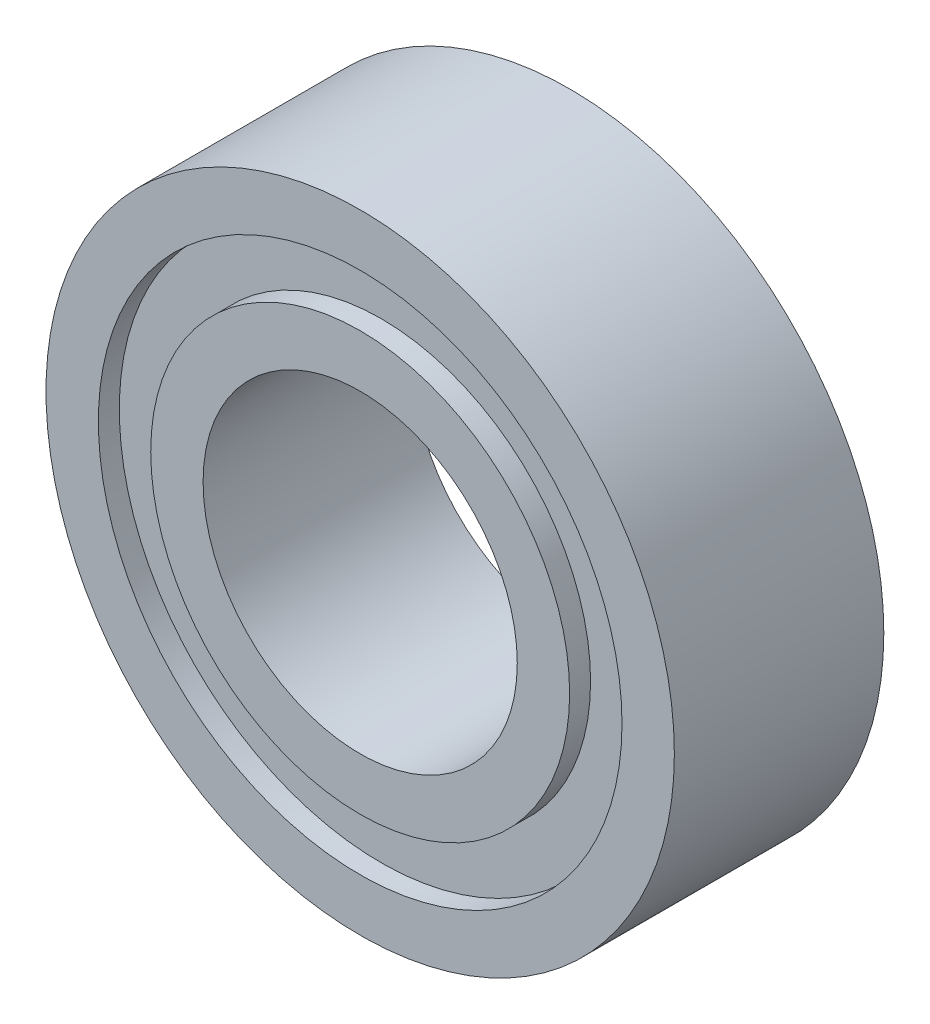
ISO-10303-21;
HEADER;
FILE_DESCRIPTION(('STEP AP214'),'2;1');
FILE_NAME('part.step','',(''),(''),'','','');
FILE_SCHEMA(('AUTOMOTIVE_DESIGN { 1 0 10303 214 1 1 1 1 }'));
ENDSEC;
DATA;
#1=APPLICATION_CONTEXT('core data for automotive mechanical design processes');
#2=APPLICATION_PROTOCOL_DEFINITION('international standard','automotive_design',2000,#1);
#3=PRODUCT_CONTEXT('',#1,'mechanical');
#4=PRODUCT('Part','Part','',(#3));
#5=PRODUCT_RELATED_PRODUCT_CATEGORY('part','',(#4));
#6=PRODUCT_DEFINITION_FORMATION('','',#4);
#7=PRODUCT_DEFINITION_CONTEXT('part definition',#1,'design');
#8=PRODUCT_DEFINITION('design','',#6,#7);
#9=PRODUCT_DEFINITION_SHAPE('','',#8);
#10=(LENGTH_UNIT() NAMED_UNIT(*) SI_UNIT(.MILLI.,.METRE.));
#11=(NAMED_UNIT(*) PLANE_ANGLE_UNIT() SI_UNIT($,.RADIAN.));
#12=(NAMED_UNIT(*) SI_UNIT($,.STERADIAN.) SOLID_ANGLE_UNIT());
#13=UNCERTAINTY_MEASURE_WITH_UNIT(LENGTH_MEASURE(1.E-05),#10,'distance_accuracy_value','');
#14=(GEOMETRIC_REPRESENTATION_CONTEXT(3) GLOBAL_UNCERTAINTY_ASSIGNED_CONTEXT((#13)) GLOBAL_UNIT_ASSIGNED_CONTEXT((#10,
#11,#12)) REPRESENTATION_CONTEXT('',''));
#15=CARTESIAN_POINT('',(0.,0.,0.));
#16=DIRECTION('',(0.,0.,1.));
#17=DIRECTION('',(1.,0.,0.));
#18=AXIS2_PLACEMENT_3D('',#15,#16,#17);
#19=CARTESIAN_POINT('',(0.,0.,0.));
#20=DIRECTION('',(0.,0.,1.));
#21=DIRECTION('',(1.,0.,0.));
#22=AXIS2_PLACEMENT_3D('',#19,#20,#21);
#23=PLANE('',#22);
#24=CARTESIAN_POINT('',(0.,0.,0.));
#25=DIRECTION('',(0.,0.,1.));
#26=DIRECTION('',(1.,0.,0.));
#27=AXIS2_PLACEMENT_3D('',#24,#25,#26);
#28=CIRCLE('',#27,2.38125);
#29=CARTESIAN_POINT('',(2.38125,0.,0.));
#30=VERTEX_POINT('',#29);
#31=EDGE_CURVE('E64',#30,#30,#28,.T.);
#32=ORIENTED_EDGE('',*,*,#31,.T.);
#33=EDGE_LOOP('',(#32));
#34=FACE_BOUND('',#33,.T.);
#35=CARTESIAN_POINT('',(0.,0.,0.));
#36=DIRECTION('',(0.,0.,-1.));
#37=DIRECTION('',(-1.,0.,0.));
#38=AXIS2_PLACEMENT_3D('',#35,#36,#37);
#39=CIRCLE('',#38,3.175);
#40=CARTESIAN_POINT('',(-3.175,0.,0.));
#41=VERTEX_POINT('',#40);
#42=EDGE_CURVE('E94',#41,#41,#39,.T.);
#43=ORIENTED_EDGE('',*,*,#42,.T.);
#44=EDGE_LOOP('',(#43));
#45=FACE_BOUND('',#44,.T.);
#46=ADVANCED_FACE('F47',(#34,#45),#23,.F.);
#47=CARTESIAN_POINT('',(0.,0.,3.175));
#48=DIRECTION('',(0.,0.,1.));
#49=DIRECTION('',(1.,0.,0.));
#50=AXIS2_PLACEMENT_3D('',#47,#48,#49);
#51=PLANE('',#50);
#52=CARTESIAN_POINT('',(0.,0.,3.175));
#53=DIRECTION('',(0.,0.,1.));
#54=DIRECTION('',(1.,0.,0.));
#55=AXIS2_PLACEMENT_3D('',#52,#53,#54);
#56=CIRCLE('',#55,2.38125);
#57=CARTESIAN_POINT('',(2.38125,0.,3.175));
#58=VERTEX_POINT('',#57);
#59=EDGE_CURVE('E62',#58,#58,#56,.T.);
#60=ORIENTED_EDGE('',*,*,#59,.F.);
#61=EDGE_LOOP('',(#60));
#62=FACE_BOUND('',#61,.T.);
#63=CARTESIAN_POINT('',(0.,0.,3.175));
#64=DIRECTION('',(0.,0.,1.));
#65=DIRECTION('',(1.,0.,0.));
#66=AXIS2_PLACEMENT_3D('',#63,#64,#65);
#67=CIRCLE('',#66,3.175);
#68=CARTESIAN_POINT('',(3.175,0.,3.175));
#69=VERTEX_POINT('',#68);
#70=EDGE_CURVE('E79',#69,#69,#67,.T.);
#71=ORIENTED_EDGE('',*,*,#70,.T.);
#72=EDGE_LOOP('',(#71));
#73=FACE_BOUND('',#72,.T.);
#74=ADVANCED_FACE('F134',(#62,#73),#51,.T.);
#75=CARTESIAN_POINT('',(0.,0.,3.175));
#76=DIRECTION('',(0.,0.,1.));
#77=DIRECTION('',(1.,0.,0.));
#78=AXIS2_PLACEMENT_3D('',#75,#76,#77);
#79=CIRCLE('',#78,3.96875);
#80=CARTESIAN_POINT('',(3.96875,0.,3.175));
#81=VERTEX_POINT('',#80);
#82=EDGE_CURVE('E72',#81,#81,#79,.T.);
#83=ORIENTED_EDGE('',*,*,#82,.F.);
#84=EDGE_LOOP('',(#83));
#85=FACE_BOUND('',#84,.T.);
#86=CARTESIAN_POINT('',(0.,0.,3.175));
#87=DIRECTION('',(0.,0.,1.));
#88=DIRECTION('',(1.,0.,0.));
#89=AXIS2_PLACEMENT_3D('',#86,#87,#88);
#90=CIRCLE('',#89,4.7625);
#91=CARTESIAN_POINT('',(4.7625,0.,3.175));
#92=VERTEX_POINT('',#91);
#93=EDGE_CURVE('E10',#92,#92,#90,.T.);
#94=ORIENTED_EDGE('',*,*,#93,.T.);
#95=EDGE_LOOP('',(#94));
#96=FACE_BOUND('',#95,.T.);
#97=ADVANCED_FACE('F121',(#85,#96),#51,.T.);
#98=CARTESIAN_POINT('',(0.,0.,0.));
#99=DIRECTION('',(0.,0.,-1.));
#100=DIRECTION('',(-1.,0.,0.));
#101=AXIS2_PLACEMENT_3D('',#98,#99,#100);
#102=CIRCLE('',#101,3.96875);
#103=CARTESIAN_POINT('',(-3.96875,0.,0.));
#104=VERTEX_POINT('',#103);
#105=EDGE_CURVE('E86',#104,#104,#102,.T.);
#106=ORIENTED_EDGE('',*,*,#105,.F.);
#107=EDGE_LOOP('',(#106));
#108=FACE_BOUND('',#107,.T.);
#109=CARTESIAN_POINT('',(0.,0.,0.));
#110=DIRECTION('',(0.,0.,1.));
#111=DIRECTION('',(1.,0.,0.));
#112=AXIS2_PLACEMENT_3D('',#109,#110,#111);
#113=CIRCLE('',#112,4.7625);
#114=CARTESIAN_POINT('',(4.7625,0.,0.));
#115=VERTEX_POINT('',#114);
#116=EDGE_CURVE('E51',#115,#115,#113,.T.);
#117=ORIENTED_EDGE('',*,*,#116,.F.);
#118=EDGE_LOOP('',(#117));
#119=FACE_BOUND('',#118,.T.);
#120=ADVANCED_FACE('F118',(#108,#119),#23,.F.);
#121=CARTESIAN_POINT('',(0.,0.,3.175));
#122=DIRECTION('',(0.,0.,-1.));
#123=DIRECTION('',(-1.,0.,0.));
#124=AXIS2_PLACEMENT_3D('',#121,#122,#123);
#125=CYLINDRICAL_SURFACE('',#124,4.7625);
#126=ORIENTED_EDGE('',*,*,#93,.F.);
#127=EDGE_LOOP('',(#126));
#128=FACE_BOUND('',#127,.T.);
#129=ORIENTED_EDGE('',*,*,#116,.T.);
#130=EDGE_LOOP('',(#129));
#131=FACE_BOUND('',#130,.T.);
#132=ADVANCED_FACE('F49',(#128,#131),#125,.T.);
#133=CARTESIAN_POINT('',(0.,0.,3.175));
#134=DIRECTION('',(0.,0.,-1.));
#135=DIRECTION('',(-1.,0.,0.));
#136=AXIS2_PLACEMENT_3D('',#133,#134,#135);
#137=CYLINDRICAL_SURFACE('',#136,2.38125);
#138=ORIENTED_EDGE('',*,*,#59,.T.);
#139=EDGE_LOOP('',(#138));
#140=FACE_BOUND('',#139,.T.);
#141=ORIENTED_EDGE('',*,*,#31,.F.);
#142=EDGE_LOOP('',(#141));
#143=FACE_BOUND('',#142,.T.);
#144=ADVANCED_FACE('F125',(#140,#143),#137,.F.);
#145=CARTESIAN_POINT('',(0.,0.,2.8575));
#146=DIRECTION('',(0.,0.,1.));
#147=DIRECTION('',(1.,0.,0.));
#148=AXIS2_PLACEMENT_3D('',#145,#146,#147);
#149=CYLINDRICAL_SURFACE('',#148,3.96875);
#150=CARTESIAN_POINT('',(0.,0.,2.8575));
#151=DIRECTION('',(0.,0.,1.));
#152=DIRECTION('',(1.,0.,0.));
#153=AXIS2_PLACEMENT_3D('',#150,#151,#152);
#154=CIRCLE('',#153,3.96875);
#155=CARTESIAN_POINT('',(3.96875,0.,2.8575));
#156=VERTEX_POINT('',#155);
#157=EDGE_CURVE('E68',#156,#156,#154,.T.);
#158=ORIENTED_EDGE('',*,*,#157,.F.);
#159=EDGE_LOOP('',(#158));
#160=FACE_BOUND('',#159,.T.);
#161=ORIENTED_EDGE('',*,*,#82,.T.);
#162=EDGE_LOOP('',(#161));
#163=FACE_BOUND('',#162,.T.);
#164=ADVANCED_FACE('F130',(#160,#163),#149,.F.);
#165=CARTESIAN_POINT('',(0.,0.,2.8575));
#166=DIRECTION('',(0.,0.,1.));
#167=DIRECTION('',(1.,0.,0.));
#168=AXIS2_PLACEMENT_3D('',#165,#166,#167);
#169=PLANE('',#168);
#170=CARTESIAN_POINT('',(0.,0.,2.8575));
#171=DIRECTION('',(0.,0.,1.));
#172=DIRECTION('',(1.,0.,0.));
#173=AXIS2_PLACEMENT_3D('',#170,#171,#172);
#174=CIRCLE('',#173,3.175);
#175=CARTESIAN_POINT('',(3.175,0.,2.8575));
#176=VERTEX_POINT('',#175);
#177=EDGE_CURVE('E76',#176,#176,#174,.T.);
#178=ORIENTED_EDGE('',*,*,#177,.F.);
#179=EDGE_LOOP('',(#178));
#180=FACE_BOUND('',#179,.T.);
#181=ORIENTED_EDGE('',*,*,#157,.T.);
#182=EDGE_LOOP('',(#181));
#183=FACE_BOUND('',#182,.T.);
#184=ADVANCED_FACE('F146',(#180,#183),#169,.T.);
#185=CARTESIAN_POINT('',(0.,0.,2.8575));
#186=DIRECTION('',(0.,0.,1.));
#187=DIRECTION('',(1.,0.,0.));
#188=AXIS2_PLACEMENT_3D('',#185,#186,#187);
#189=CYLINDRICAL_SURFACE('',#188,3.175);
#190=ORIENTED_EDGE('',*,*,#177,.T.);
#191=EDGE_LOOP('',(#190));
#192=FACE_BOUND('',#191,.T.);
#193=ORIENTED_EDGE('',*,*,#70,.F.);
#194=EDGE_LOOP('',(#193));
#195=FACE_BOUND('',#194,.T.);
#196=ADVANCED_FACE('F114',(#192,#195),#189,.T.);
#197=CARTESIAN_POINT('',(0.,0.,0.635));
#198=DIRECTION('',(0.,0.,-1.));
#199=DIRECTION('',(-1.,0.,0.));
#200=AXIS2_PLACEMENT_3D('',#197,#198,#199);
#201=CYLINDRICAL_SURFACE('',#200,3.96875);
#202=CARTESIAN_POINT('',(0.,0.,0.635));
#203=DIRECTION('',(0.,0.,-1.));
#204=DIRECTION('',(-1.,0.,0.));
#205=AXIS2_PLACEMENT_3D('',#202,#203,#204);
#206=CIRCLE('',#205,3.96875);
#207=CARTESIAN_POINT('',(-3.96875,0.,0.635));
#208=VERTEX_POINT('',#207);
#209=EDGE_CURVE('E83',#208,#208,#206,.T.);
#210=ORIENTED_EDGE('',*,*,#209,.F.);
#211=EDGE_LOOP('',(#210));
#212=FACE_BOUND('',#211,.T.);
#213=ORIENTED_EDGE('',*,*,#105,.T.);
#214=EDGE_LOOP('',(#213));
#215=FACE_BOUND('',#214,.T.);
#216=ADVANCED_FACE('F108',(#212,#215),#201,.F.);
#217=CARTESIAN_POINT('',(0.,0.,0.635));
#218=DIRECTION('',(0.,0.,-1.));
#219=DIRECTION('',(-1.,0.,0.));
#220=AXIS2_PLACEMENT_3D('',#217,#218,#219);
#221=PLANE('',#220);
#222=CARTESIAN_POINT('',(0.,0.,0.635));
#223=DIRECTION('',(0.,0.,-1.));
#224=DIRECTION('',(-1.,0.,0.));
#225=AXIS2_PLACEMENT_3D('',#222,#223,#224);
#226=CIRCLE('',#225,3.175);
#227=CARTESIAN_POINT('',(-3.175,0.,0.635));
#228=VERTEX_POINT('',#227);
#229=EDGE_CURVE('E90',#228,#228,#226,.T.);
#230=ORIENTED_EDGE('',*,*,#229,.F.);
#231=EDGE_LOOP('',(#230));
#232=FACE_BOUND('',#231,.T.);
#233=ORIENTED_EDGE('',*,*,#209,.T.);
#234=EDGE_LOOP('',(#233));
#235=FACE_BOUND('',#234,.T.);
#236=ADVANCED_FACE('F105',(#232,#235),#221,.T.);
#237=CARTESIAN_POINT('',(0.,0.,0.635));
#238=DIRECTION('',(0.,0.,-1.));
#239=DIRECTION('',(-1.,0.,0.));
#240=AXIS2_PLACEMENT_3D('',#237,#238,#239);
#241=CYLINDRICAL_SURFACE('',#240,3.175);
#242=ORIENTED_EDGE('',*,*,#229,.T.);
#243=EDGE_LOOP('',(#242));
#244=FACE_BOUND('',#243,.T.);
#245=ORIENTED_EDGE('',*,*,#42,.F.);
#246=EDGE_LOOP('',(#245));
#247=FACE_BOUND('',#246,.T.);
#248=ADVANCED_FACE('F102',(#244,#247),#241,.T.);
#249=CLOSED_SHELL('',(#46,#74,#97,#120,#132,#144,#164,#184,#196,#216,#236,#248));
#250=MANIFOLD_SOLID_BREP('B2',#249);
#251=ADVANCED_BREP_SHAPE_REPRESENTATION('',(#18,#250),#14);
#252=SHAPE_DEFINITION_REPRESENTATION(#9,#251);
ENDSEC;
END-ISO-10303-21;
